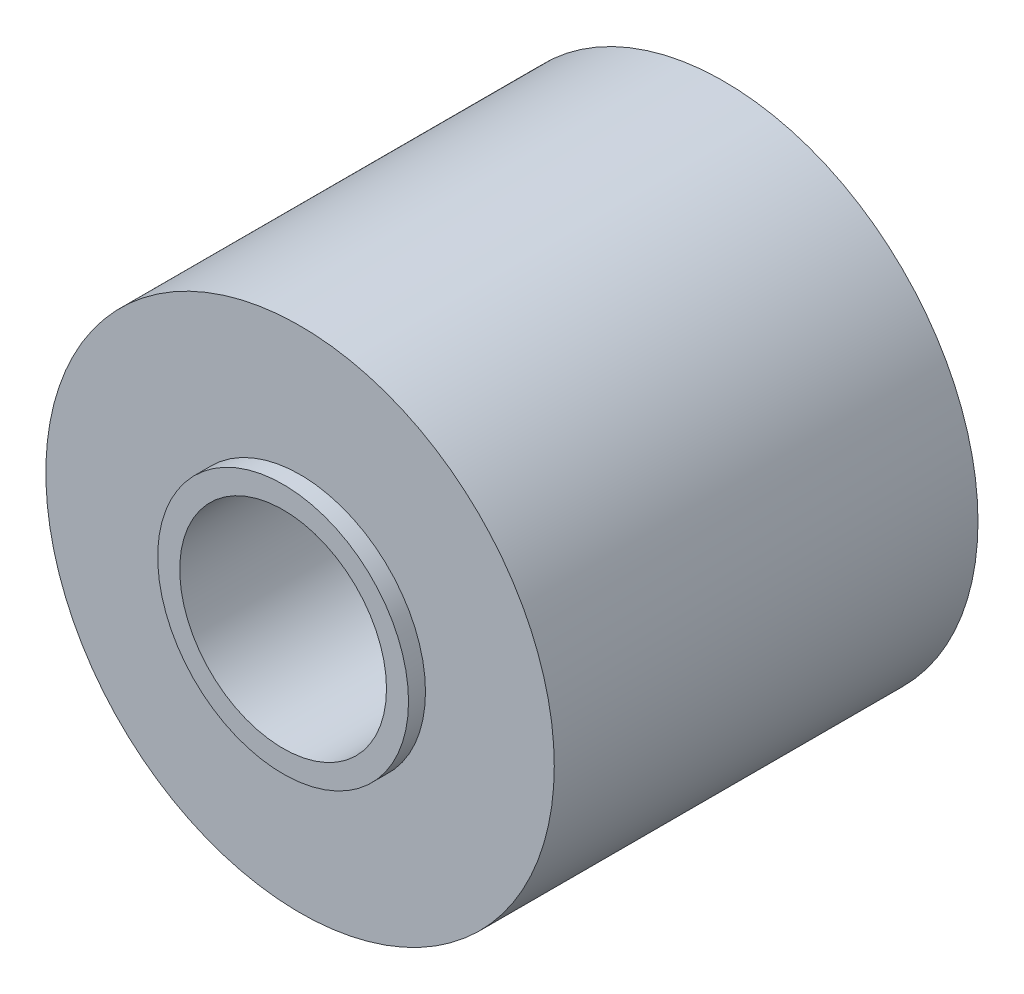
ISO-10303-21;
HEADER;
FILE_DESCRIPTION(('STEP AP214'),'2;1');
FILE_NAME('part.step','',(''),(''),'','','');
FILE_SCHEMA(('AUTOMOTIVE_DESIGN { 1 0 10303 214 1 1 1 1 }'));
ENDSEC;
DATA;
#1=APPLICATION_CONTEXT('core data for automotive mechanical design processes');
#2=APPLICATION_PROTOCOL_DEFINITION('international standard','automotive_design',2000,#1);
#3=PRODUCT_CONTEXT('',#1,'mechanical');
#4=PRODUCT('Part','Part','',(#3));
#5=PRODUCT_RELATED_PRODUCT_CATEGORY('part','',(#4));
#6=PRODUCT_DEFINITION_FORMATION('','',#4);
#7=PRODUCT_DEFINITION_CONTEXT('part definition',#1,'design');
#8=PRODUCT_DEFINITION('design','',#6,#7);
#9=PRODUCT_DEFINITION_SHAPE('','',#8);
#10=(LENGTH_UNIT() NAMED_UNIT(*) SI_UNIT(.MILLI.,.METRE.));
#11=(NAMED_UNIT(*) PLANE_ANGLE_UNIT() SI_UNIT($,.RADIAN.));
#12=(NAMED_UNIT(*) SI_UNIT($,.STERADIAN.) SOLID_ANGLE_UNIT());
#13=UNCERTAINTY_MEASURE_WITH_UNIT(LENGTH_MEASURE(1.E-05),#10,'distance_accuracy_value','');
#14=(GEOMETRIC_REPRESENTATION_CONTEXT(3) GLOBAL_UNCERTAINTY_ASSIGNED_CONTEXT((#13)) GLOBAL_UNIT_ASSIGNED_CONTEXT((#10,
#11,#12)) REPRESENTATION_CONTEXT('',''));
#15=CARTESIAN_POINT('',(0.,0.,0.));
#16=DIRECTION('',(0.,0.,1.));
#17=DIRECTION('',(1.,0.,0.));
#18=AXIS2_PLACEMENT_3D('',#15,#16,#17);
#19=CARTESIAN_POINT('',(0.,0.,12.5));
#20=DIRECTION('',(0.,0.,1.));
#21=DIRECTION('',(1.,0.,0.));
#22=AXIS2_PLACEMENT_3D('',#19,#20,#21);
#23=PLANE('',#22);
#24=CARTESIAN_POINT('',(0.,0.,12.5));
#25=DIRECTION('',(0.,0.,1.));
#26=DIRECTION('',(1.,0.,0.));
#27=AXIS2_PLACEMENT_3D('',#24,#25,#26);
#28=CIRCLE('',#27,7.5);
#29=CARTESIAN_POINT('',(7.5,0.,12.5));
#30=VERTEX_POINT('',#29);
#31=EDGE_CURVE('E10',#30,#30,#28,.T.);
#32=ORIENTED_EDGE('',*,*,#31,.T.);
#33=EDGE_LOOP('',(#32));
#34=FACE_BOUND('',#33,.T.);
#35=CARTESIAN_POINT('',(0.,0.,12.5));
#36=DIRECTION('',(0.,0.,1.));
#37=DIRECTION('',(1.,0.,0.));
#38=AXIS2_PLACEMENT_3D('',#35,#36,#37);
#39=CIRCLE('',#38,3.7);
#40=CARTESIAN_POINT('',(3.7,0.,12.5));
#41=VERTEX_POINT('',#40);
#42=EDGE_CURVE('E50',#41,#41,#39,.T.);
#43=ORIENTED_EDGE('',*,*,#42,.F.);
#44=EDGE_LOOP('',(#43));
#45=FACE_BOUND('',#44,.T.);
#46=ADVANCED_FACE('F34',(#34,#45),#23,.T.);
#47=CARTESIAN_POINT('',(0.,0.,0.));
#48=DIRECTION('',(0.,0.,1.));
#49=DIRECTION('',(1.,0.,0.));
#50=AXIS2_PLACEMENT_3D('',#47,#48,#49);
#51=PLANE('',#50);
#52=CARTESIAN_POINT('',(0.,0.,0.));
#53=DIRECTION('',(0.,0.,1.));
#54=DIRECTION('',(1.,0.,0.));
#55=AXIS2_PLACEMENT_3D('',#52,#53,#54);
#56=CIRCLE('',#55,7.5);
#57=CARTESIAN_POINT('',(7.5,0.,0.));
#58=VERTEX_POINT('',#57);
#59=EDGE_CURVE('E38',#58,#58,#56,.T.);
#60=ORIENTED_EDGE('',*,*,#59,.F.);
#61=EDGE_LOOP('',(#60));
#62=FACE_BOUND('',#61,.T.);
#63=CARTESIAN_POINT('',(0.,0.,0.));
#64=DIRECTION('',(0.,0.,1.));
#65=DIRECTION('',(1.,0.,0.));
#66=AXIS2_PLACEMENT_3D('',#63,#64,#65);
#67=CIRCLE('',#66,3.05);
#68=CARTESIAN_POINT('',(3.05,0.,0.));
#69=VERTEX_POINT('',#68);
#70=EDGE_CURVE('E45',#69,#69,#67,.T.);
#71=ORIENTED_EDGE('',*,*,#70,.T.);
#72=EDGE_LOOP('',(#71));
#73=FACE_BOUND('',#72,.T.);
#74=ADVANCED_FACE('F75',(#62,#73),#51,.F.);
#75=CARTESIAN_POINT('',(0.,0.,12.5));
#76=DIRECTION('',(0.,0.,-1.));
#77=DIRECTION('',(-1.,0.,0.));
#78=AXIS2_PLACEMENT_3D('',#75,#76,#77);
#79=CYLINDRICAL_SURFACE('',#78,7.5);
#80=ORIENTED_EDGE('',*,*,#31,.F.);
#81=EDGE_LOOP('',(#80));
#82=FACE_BOUND('',#81,.T.);
#83=ORIENTED_EDGE('',*,*,#59,.T.);
#84=EDGE_LOOP('',(#83));
#85=FACE_BOUND('',#84,.T.);
#86=ADVANCED_FACE('F36',(#82,#85),#79,.T.);
#87=CARTESIAN_POINT('',(0.,0.,12.5));
#88=DIRECTION('',(0.,0.,-1.));
#89=DIRECTION('',(-1.,0.,0.));
#90=AXIS2_PLACEMENT_3D('',#87,#88,#89);
#91=CYLINDRICAL_SURFACE('',#90,3.05);
#92=ORIENTED_EDGE('',*,*,#70,.F.);
#93=EDGE_LOOP('',(#92));
#94=FACE_BOUND('',#93,.T.);
#95=CARTESIAN_POINT('',(0.,0.,13.));
#96=DIRECTION('',(0.,0.,1.));
#97=DIRECTION('',(1.,0.,0.));
#98=AXIS2_PLACEMENT_3D('',#95,#96,#97);
#99=CIRCLE('',#98,3.05);
#100=CARTESIAN_POINT('',(3.05,0.,13.));
#101=VERTEX_POINT('',#100);
#102=EDGE_CURVE('E53',#101,#101,#99,.T.);
#103=ORIENTED_EDGE('',*,*,#102,.T.);
#104=EDGE_LOOP('',(#103));
#105=FACE_BOUND('',#104,.T.);
#106=ADVANCED_FACE('F59',(#94,#105),#91,.F.);
#107=CARTESIAN_POINT('',(0.,0.,13.));
#108=DIRECTION('',(0.,0.,1.));
#109=DIRECTION('',(1.,0.,0.));
#110=AXIS2_PLACEMENT_3D('',#107,#108,#109);
#111=PLANE('',#110);
#112=CARTESIAN_POINT('',(0.,0.,13.));
#113=DIRECTION('',(0.,0.,1.));
#114=DIRECTION('',(1.,0.,0.));
#115=AXIS2_PLACEMENT_3D('',#112,#113,#114);
#116=CIRCLE('',#115,3.7);
#117=CARTESIAN_POINT('',(3.7,0.,13.));
#118=VERTEX_POINT('',#117);
#119=EDGE_CURVE('E49',#118,#118,#116,.T.);
#120=ORIENTED_EDGE('',*,*,#119,.T.);
#121=EDGE_LOOP('',(#120));
#122=FACE_BOUND('',#121,.T.);
#123=ORIENTED_EDGE('',*,*,#102,.F.);
#124=EDGE_LOOP('',(#123));
#125=FACE_BOUND('',#124,.T.);
#126=ADVANCED_FACE('F61',(#122,#125),#111,.T.);
#127=CARTESIAN_POINT('',(0.,0.,13.));
#128=DIRECTION('',(0.,0.,-1.));
#129=DIRECTION('',(-1.,0.,0.));
#130=AXIS2_PLACEMENT_3D('',#127,#128,#129);
#131=CYLINDRICAL_SURFACE('',#130,3.7);
#132=ORIENTED_EDGE('',*,*,#119,.F.);
#133=EDGE_LOOP('',(#132));
#134=FACE_BOUND('',#133,.T.);
#135=ORIENTED_EDGE('',*,*,#42,.T.);
#136=EDGE_LOOP('',(#135));
#137=FACE_BOUND('',#136,.T.);
#138=ADVANCED_FACE('F63',(#134,#137),#131,.T.);
#139=CLOSED_SHELL('',(#46,#74,#86,#106,#126,#138));
#140=MANIFOLD_SOLID_BREP('B2',#139);
#141=ADVANCED_BREP_SHAPE_REPRESENTATION('',(#18,#140),#14);
#142=SHAPE_DEFINITION_REPRESENTATION(#9,#141);
ENDSEC;
END-ISO-10303-21;
